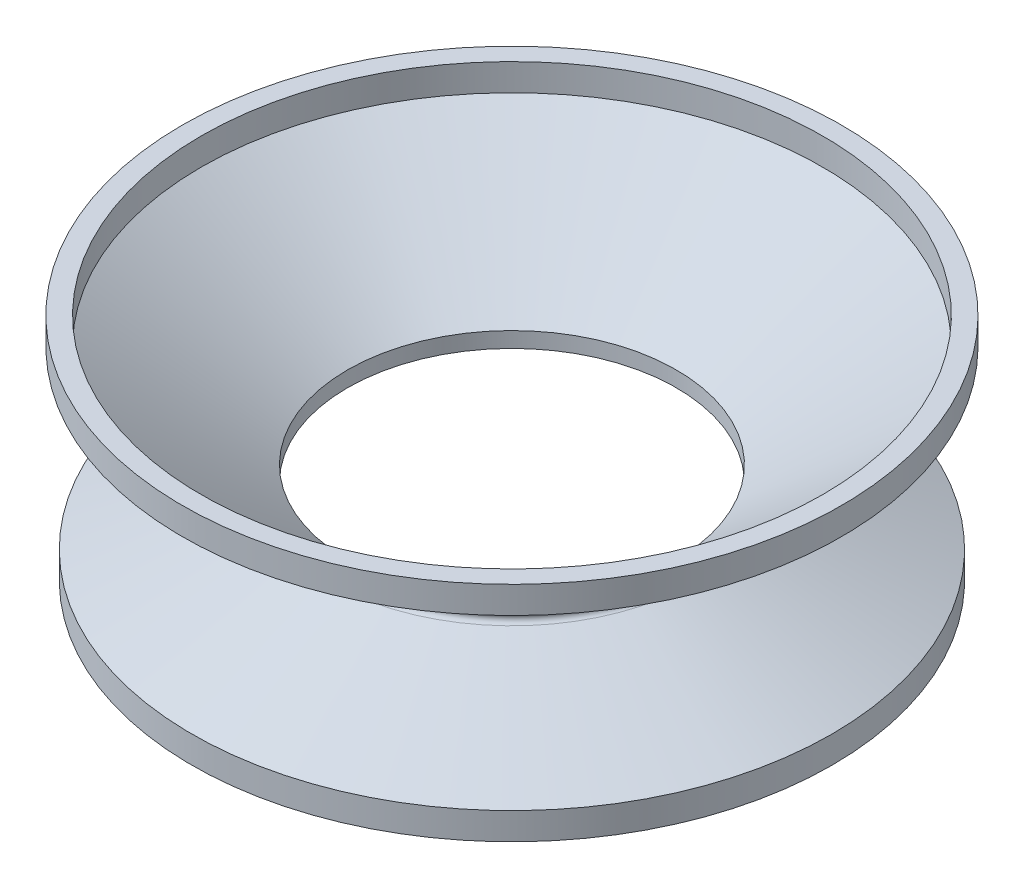
ISO-10303-21;
HEADER;
FILE_DESCRIPTION(('STEP AP214'),'2;1');
FILE_NAME('part.step','',(''),(''),'','','');
FILE_SCHEMA(('AUTOMOTIVE_DESIGN { 1 0 10303 214 1 1 1 1 }'));
ENDSEC;
DATA;
#1=APPLICATION_CONTEXT('core data for automotive mechanical design processes');
#2=APPLICATION_PROTOCOL_DEFINITION('international standard','automotive_design',2000,#1);
#3=PRODUCT_CONTEXT('',#1,'mechanical');
#4=PRODUCT('Part','Part','',(#3));
#5=PRODUCT_RELATED_PRODUCT_CATEGORY('part','',(#4));
#6=PRODUCT_DEFINITION_FORMATION('','',#4);
#7=PRODUCT_DEFINITION_CONTEXT('part definition',#1,'design');
#8=PRODUCT_DEFINITION('design','',#6,#7);
#9=PRODUCT_DEFINITION_SHAPE('','',#8);
#10=(LENGTH_UNIT() NAMED_UNIT(*) SI_UNIT(.MILLI.,.METRE.));
#11=(NAMED_UNIT(*) PLANE_ANGLE_UNIT() SI_UNIT($,.RADIAN.));
#12=(NAMED_UNIT(*) SI_UNIT($,.STERADIAN.) SOLID_ANGLE_UNIT());
#13=UNCERTAINTY_MEASURE_WITH_UNIT(LENGTH_MEASURE(1.E-05),#10,'distance_accuracy_value','');
#14=(GEOMETRIC_REPRESENTATION_CONTEXT(3) GLOBAL_UNCERTAINTY_ASSIGNED_CONTEXT((#13)) GLOBAL_UNIT_ASSIGNED_CONTEXT((#10,
#11,#12)) REPRESENTATION_CONTEXT('',''));
#15=CARTESIAN_POINT('',(0.,0.,0.));
#16=DIRECTION('',(0.,0.,1.));
#17=DIRECTION('',(1.,0.,0.));
#18=AXIS2_PLACEMENT_3D('',#15,#16,#17);
#19=CARTESIAN_POINT('',(13.6323553351938,0.,0.));
#20=DIRECTION('',(0.,-1.,0.));
#21=DIRECTION('',(1.,0.,0.));
#22=AXIS2_PLACEMENT_3D('',#19,#20,#21);
#23=CONICAL_SURFACE('',#22,12.9695733825598,1.13446401379632);
#24=CARTESIAN_POINT('',(13.6323553351938,-0.292798520616529,0.));
#25=DIRECTION('',(0.,-1.,0.));
#26=DIRECTION('',(1.,0.,0.));
#27=AXIS2_PLACEMENT_3D('',#24,#25,#26);
#28=CIRCLE('',#27,13.597481836337);
#29=CARTESIAN_POINT('',(27.2298371715308,-0.292798520616526,0.));
#30=VERTEX_POINT('',#29);
#31=EDGE_CURVE('E10',#30,#30,#28,.T.);
#32=ORIENTED_EDGE('',*,*,#31,.T.);
#33=EDGE_LOOP('',(#32));
#34=FACE_BOUND('',#33,.T.);
#35=CARTESIAN_POINT('',(13.6323553351938,-5.,0.));
#36=DIRECTION('',(0.,-1.,0.));
#37=DIRECTION('',(1.,0.,0.));
#38=AXIS2_PLACEMENT_3D('',#35,#36,#37);
#39=CIRCLE('',#38,23.6921079851078);
#40=CARTESIAN_POINT('',(37.3244633203016,-4.99999999999999,0.));
#41=VERTEX_POINT('',#40);
#42=EDGE_CURVE('E88',#41,#41,#39,.T.);
#43=ORIENTED_EDGE('',*,*,#42,.F.);
#44=EDGE_LOOP('',(#43));
#45=FACE_BOUND('',#44,.T.);
#46=ADVANCED_FACE('F43',(#34,#45),#23,.T.);
#47=CARTESIAN_POINT('',(13.6323553351938,8.00000000000001,0.));
#48=DIRECTION('',(0.,1.,0.));
#49=DIRECTION('',(-1.,0.,0.));
#50=AXIS2_PLACEMENT_3D('',#47,#48,#49);
#51=CONICAL_SURFACE('',#50,24.3947574364969,0.959931088596887);
#52=CARTESIAN_POINT('',(13.6323553351938,0.397385411913732,0.));
#53=DIRECTION('',(0.,1.,0.));
#54=DIRECTION('',(-1.,0.,0.));
#55=AXIS2_PLACEMENT_3D('',#52,#53,#54);
#56=CIRCLE('',#55,13.5370985664928);
#57=CARTESIAN_POINT('',(0.0952567687009763,0.397385411913729,0.));
#58=VERTEX_POINT('',#57);
#59=EDGE_CURVE('E51',#58,#58,#56,.T.);
#60=ORIENTED_EDGE('',*,*,#59,.T.);
#61=EDGE_LOOP('',(#60));
#62=FACE_BOUND('',#61,.T.);
#63=CARTESIAN_POINT('',(13.6323553351938,8.00000000000001,0.));
#64=DIRECTION('',(0.,1.,0.));
#65=DIRECTION('',(-1.,0.,0.));
#66=AXIS2_PLACEMENT_3D('',#63,#64,#65);
#67=CIRCLE('',#66,24.3947574364969);
#68=CARTESIAN_POINT('',(-10.7624021013031,8.,0.));
#69=VERTEX_POINT('',#68);
#70=EDGE_CURVE('E56',#69,#69,#67,.T.);
#71=ORIENTED_EDGE('',*,*,#70,.F.);
#72=EDGE_LOOP('',(#71));
#73=FACE_BOUND('',#72,.T.);
#74=ADVANCED_FACE('F120',(#62,#73),#51,.T.);
#75=CARTESIAN_POINT('',(13.6323553351938,0.416453640441403,0.));
#76=DIRECTION('',(0.,1.,0.));
#77=DIRECTION('',(-1.,0.,0.));
#78=AXIS2_PLACEMENT_3D('',#75,#76,#77);
#79=CONICAL_SURFACE('',#78,12.1695733825598,0.959931088596887);
#80=CARTESIAN_POINT('',(13.6323553351938,8.,0.));
#81=DIRECTION('',(0.,1.,0.));
#82=DIRECTION('',(-1.,0.,0.));
#83=AXIS2_PLACEMENT_3D('',#80,#81,#82);
#84=CIRCLE('',#83,23.);
#85=CARTESIAN_POINT('',(-9.36764466480621,8.,0.));
#86=VERTEX_POINT('',#85);
#87=EDGE_CURVE('E80',#86,#86,#84,.T.);
#88=ORIENTED_EDGE('',*,*,#87,.T.);
#89=EDGE_LOOP('',(#88));
#90=FACE_BOUND('',#89,.T.);
#91=CARTESIAN_POINT('',(13.6323553351938,0.416453640441403,0.));
#92=DIRECTION('',(0.,1.,0.));
#93=DIRECTION('',(-1.,0.,0.));
#94=AXIS2_PLACEMENT_3D('',#91,#92,#93);
#95=CIRCLE('',#94,12.1695733825598);
#96=CARTESIAN_POINT('',(1.46278195263397,0.4164536404414,0.));
#97=VERTEX_POINT('',#96);
#98=EDGE_CURVE('E61',#97,#97,#95,.T.);
#99=ORIENTED_EDGE('',*,*,#98,.F.);
#100=EDGE_LOOP('',(#99));
#101=FACE_BOUND('',#100,.T.);
#102=ADVANCED_FACE('F125',(#90,#101),#79,.F.);
#103=CARTESIAN_POINT('',(13.6323553351938,7.60901803281974,0.));
#104=DIRECTION('',(0.,1.,0.));
#105=DIRECTION('',(-1.,0.,0.));
#106=AXIS2_PLACEMENT_3D('',#103,#104,#105);
#107=CYLINDRICAL_SURFACE('',#106,12.1695733825598);
#108=ORIENTED_EDGE('',*,*,#98,.T.);
#109=EDGE_LOOP('',(#108));
#110=FACE_BOUND('',#109,.T.);
#111=CARTESIAN_POINT('',(13.6323553351938,-0.730331792438492,0.));
#112=DIRECTION('',(0.,1.,0.));
#113=DIRECTION('',(-1.,0.,0.));
#114=AXIS2_PLACEMENT_3D('',#111,#112,#113);
#115=CIRCLE('',#114,12.1695733825598);
#116=CARTESIAN_POINT('',(1.46278195263397,-0.730331792438495,0.));
#117=VERTEX_POINT('',#116);
#118=EDGE_CURVE('E67',#117,#117,#115,.T.);
#119=ORIENTED_EDGE('',*,*,#118,.F.);
#120=EDGE_LOOP('',(#119));
#121=FACE_BOUND('',#120,.T.);
#122=ADVANCED_FACE('F131',(#110,#121),#107,.F.);
#123=CARTESIAN_POINT('',(13.6323553351938,-4.99999999999999,0.));
#124=DIRECTION('',(0.,-1.,0.));
#125=DIRECTION('',(1.,0.,0.));
#126=AXIS2_PLACEMENT_3D('',#123,#124,#125);
#127=CONICAL_SURFACE('',#126,21.3259064019553,1.13446401379632);
#128=ORIENTED_EDGE('',*,*,#118,.T.);
#129=EDGE_LOOP('',(#128));
#130=FACE_BOUND('',#129,.T.);
#131=CARTESIAN_POINT('',(13.6323553351938,-4.99999999999999,0.));
#132=DIRECTION('',(0.,1.,0.));
#133=DIRECTION('',(-1.,0.,0.));
#134=AXIS2_PLACEMENT_3D('',#131,#132,#133);
#135=CIRCLE('',#134,21.3259064019553);
#136=CARTESIAN_POINT('',(-7.69355106676147,-5.,0.));
#137=VERTEX_POINT('',#136);
#138=EDGE_CURVE('E71',#137,#137,#135,.T.);
#139=ORIENTED_EDGE('',*,*,#138,.F.);
#140=EDGE_LOOP('',(#139));
#141=FACE_BOUND('',#140,.T.);
#142=ADVANCED_FACE('F135',(#130,#141),#127,.F.);
#143=CARTESIAN_POINT('',(13.6323553351938,0.0697245941981292,0.));
#144=DIRECTION('',(0.,1.,0.));
#145=DIRECTION('',(-1.,0.,0.));
#146=AXIS2_PLACEMENT_3D('',#143,#144,#145);
#147=TOROIDAL_SURFACE('',#146,13.7665291410332,0.4);
#148=ORIENTED_EDGE('',*,*,#31,.F.);
#149=EDGE_LOOP('',(#148));
#150=FACE_BOUND('',#149,.T.);
#151=ORIENTED_EDGE('',*,*,#59,.F.);
#152=EDGE_LOOP('',(#151));
#153=FACE_BOUND('',#152,.T.);
#154=ADVANCED_FACE('F45',(#150,#153),#147,.F.);
#155=CARTESIAN_POINT('',(13.6323553351938,10.,0.));
#156=DIRECTION('',(0.,1.,0.));
#157=DIRECTION('',(-1.,0.,0.));
#158=AXIS2_PLACEMENT_3D('',#155,#156,#157);
#159=PLANE('',#158);
#160=CARTESIAN_POINT('',(13.6323553351938,10.,0.));
#161=DIRECTION('',(0.,1.,0.));
#162=DIRECTION('',(-1.,0.,0.));
#163=AXIS2_PLACEMENT_3D('',#160,#161,#162);
#164=CIRCLE('',#163,24.3947574364969);
#165=CARTESIAN_POINT('',(-10.7624021013031,10.,0.));
#166=VERTEX_POINT('',#165);
#167=EDGE_CURVE('E75',#166,#166,#164,.T.);
#168=ORIENTED_EDGE('',*,*,#167,.T.);
#169=EDGE_LOOP('',(#168));
#170=FACE_BOUND('',#169,.T.);
#171=CARTESIAN_POINT('',(13.6323553351938,10.,0.));
#172=DIRECTION('',(0.,1.,0.));
#173=DIRECTION('',(-1.,0.,0.));
#174=AXIS2_PLACEMENT_3D('',#171,#172,#173);
#175=CIRCLE('',#174,23.);
#176=CARTESIAN_POINT('',(-9.36764466480621,10.,0.));
#177=VERTEX_POINT('',#176);
#178=EDGE_CURVE('E79',#177,#177,#175,.T.);
#179=ORIENTED_EDGE('',*,*,#178,.F.);
#180=EDGE_LOOP('',(#179));
#181=FACE_BOUND('',#180,.T.);
#182=ADVANCED_FACE('F141',(#170,#181),#159,.T.);
#183=CARTESIAN_POINT('',(13.6323553351938,10.,0.));
#184=DIRECTION('',(0.,-1.,0.));
#185=DIRECTION('',(1.,0.,0.));
#186=AXIS2_PLACEMENT_3D('',#183,#184,#185);
#187=CYLINDRICAL_SURFACE('',#186,24.3947574364969);
#188=ORIENTED_EDGE('',*,*,#167,.F.);
#189=EDGE_LOOP('',(#188));
#190=FACE_BOUND('',#189,.T.);
#191=ORIENTED_EDGE('',*,*,#70,.T.);
#192=EDGE_LOOP('',(#191));
#193=FACE_BOUND('',#192,.T.);
#194=ADVANCED_FACE('F115',(#190,#193),#187,.T.);
#195=CARTESIAN_POINT('',(13.6323553351938,10.,0.));
#196=DIRECTION('',(0.,-1.,0.));
#197=DIRECTION('',(1.,0.,0.));
#198=AXIS2_PLACEMENT_3D('',#195,#196,#197);
#199=CYLINDRICAL_SURFACE('',#198,23.);
#200=ORIENTED_EDGE('',*,*,#178,.T.);
#201=EDGE_LOOP('',(#200));
#202=FACE_BOUND('',#201,.T.);
#203=ORIENTED_EDGE('',*,*,#87,.F.);
#204=EDGE_LOOP('',(#203));
#205=FACE_BOUND('',#204,.T.);
#206=ADVANCED_FACE('F106',(#202,#205),#199,.F.);
#207=CARTESIAN_POINT('',(13.6323553351938,-6.99999999999999,0.));
#208=DIRECTION('',(0.,-1.,0.));
#209=DIRECTION('',(1.,0.,0.));
#210=AXIS2_PLACEMENT_3D('',#207,#208,#209);
#211=PLANE('',#210);
#212=CARTESIAN_POINT('',(13.6323553351938,-6.99999999999999,0.));
#213=DIRECTION('',(0.,-1.,0.));
#214=DIRECTION('',(1.,0.,0.));
#215=AXIS2_PLACEMENT_3D('',#212,#213,#214);
#216=CIRCLE('',#215,23.6921079851078);
#217=CARTESIAN_POINT('',(37.3244633203016,-6.99999999999999,0.));
#218=VERTEX_POINT('',#217);
#219=EDGE_CURVE('E84',#218,#218,#216,.T.);
#220=ORIENTED_EDGE('',*,*,#219,.T.);
#221=EDGE_LOOP('',(#220));
#222=FACE_BOUND('',#221,.T.);
#223=CARTESIAN_POINT('',(13.6323553351938,-6.99999999999999,0.));
#224=DIRECTION('',(0.,-1.,0.));
#225=DIRECTION('',(1.,0.,0.));
#226=AXIS2_PLACEMENT_3D('',#223,#224,#225);
#227=CIRCLE('',#226,21.3259064019553);
#228=CARTESIAN_POINT('',(34.9582617371491,-6.99999999999999,0.));
#229=VERTEX_POINT('',#228);
#230=EDGE_CURVE('E92',#229,#229,#227,.T.);
#231=ORIENTED_EDGE('',*,*,#230,.F.);
#232=EDGE_LOOP('',(#231));
#233=FACE_BOUND('',#232,.T.);
#234=ADVANCED_FACE('F103',(#222,#233),#211,.T.);
#235=CARTESIAN_POINT('',(13.6323553351938,-6.99999999999999,0.));
#236=DIRECTION('',(0.,1.,0.));
#237=DIRECTION('',(-1.,0.,0.));
#238=AXIS2_PLACEMENT_3D('',#235,#236,#237);
#239=CYLINDRICAL_SURFACE('',#238,23.6921079851078);
#240=ORIENTED_EDGE('',*,*,#219,.F.);
#241=EDGE_LOOP('',(#240));
#242=FACE_BOUND('',#241,.T.);
#243=ORIENTED_EDGE('',*,*,#42,.T.);
#244=EDGE_LOOP('',(#243));
#245=FACE_BOUND('',#244,.T.);
#246=ADVANCED_FACE('F105',(#242,#245),#239,.T.);
#247=CARTESIAN_POINT('',(13.6323553351938,-6.99999999999999,0.));
#248=DIRECTION('',(0.,1.,0.));
#249=DIRECTION('',(-1.,0.,0.));
#250=AXIS2_PLACEMENT_3D('',#247,#248,#249);
#251=CYLINDRICAL_SURFACE('',#250,21.3259064019553);
#252=ORIENTED_EDGE('',*,*,#230,.T.);
#253=EDGE_LOOP('',(#252));
#254=FACE_BOUND('',#253,.T.);
#255=ORIENTED_EDGE('',*,*,#138,.T.);
#256=EDGE_LOOP('',(#255));
#257=FACE_BOUND('',#256,.T.);
#258=ADVANCED_FACE('F100',(#254,#257),#251,.F.);
#259=CLOSED_SHELL('',(#46,#74,#102,#122,#142,#154,#182,#194,#206,#234,#246,#258));
#260=MANIFOLD_SOLID_BREP('B2',#259);
#261=ADVANCED_BREP_SHAPE_REPRESENTATION('',(#18,#260),#14);
#262=SHAPE_DEFINITION_REPRESENTATION(#9,#261);
ENDSEC;
END-ISO-10303-21;
